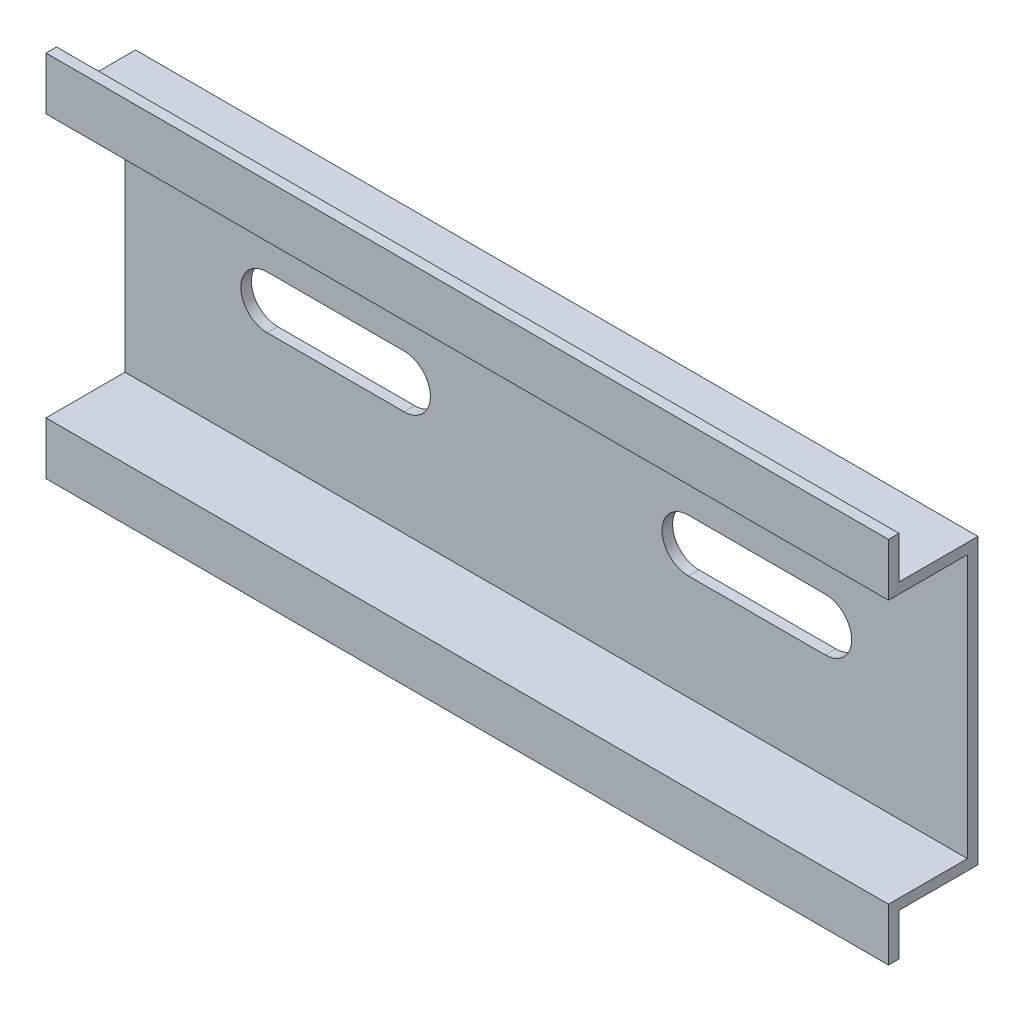
ISO-10303-21;
HEADER;
FILE_DESCRIPTION(('STEP AP214'),'2;1');
FILE_NAME('part.step','',(''),(''),'','','');
FILE_SCHEMA(('AUTOMOTIVE_DESIGN { 1 0 10303 214 1 1 1 1 }'));
ENDSEC;
DATA;
#1=APPLICATION_CONTEXT('core data for automotive mechanical design processes');
#2=APPLICATION_PROTOCOL_DEFINITION('international standard','automotive_design',2000,#1);
#3=PRODUCT_CONTEXT('',#1,'mechanical');
#4=PRODUCT('Part','Part','',(#3));
#5=PRODUCT_RELATED_PRODUCT_CATEGORY('part','',(#4));
#6=PRODUCT_DEFINITION_FORMATION('','',#4);
#7=PRODUCT_DEFINITION_CONTEXT('part definition',#1,'design');
#8=PRODUCT_DEFINITION('design','',#6,#7);
#9=PRODUCT_DEFINITION_SHAPE('','',#8);
#10=(LENGTH_UNIT() NAMED_UNIT(*) SI_UNIT(.MILLI.,.METRE.));
#11=(NAMED_UNIT(*) PLANE_ANGLE_UNIT() SI_UNIT($,.RADIAN.));
#12=(NAMED_UNIT(*) SI_UNIT($,.STERADIAN.) SOLID_ANGLE_UNIT());
#13=UNCERTAINTY_MEASURE_WITH_UNIT(LENGTH_MEASURE(1.E-05),#10,'distance_accuracy_value','');
#14=(GEOMETRIC_REPRESENTATION_CONTEXT(3) GLOBAL_UNCERTAINTY_ASSIGNED_CONTEXT((#13)) GLOBAL_UNIT_ASSIGNED_CONTEXT((#10,
#11,#12)) REPRESENTATION_CONTEXT('',''));
#15=CARTESIAN_POINT('',(0.,0.,0.));
#16=DIRECTION('',(0.,0.,1.));
#17=DIRECTION('',(1.,0.,0.));
#18=AXIS2_PLACEMENT_3D('',#15,#16,#17);
#19=CARTESIAN_POINT('',(80.,35.,0.));
#20=DIRECTION('',(0.,-1.,0.));
#21=DIRECTION('',(0.,0.,-1.));
#22=AXIS2_PLACEMENT_3D('',#19,#20,#21);
#23=PLANE('',#22);
#24=DIRECTION('',(0.,0.,1.));
#25=VECTOR('',#24,1.);
#26=CARTESIAN_POINT('',(0.,35.,0.));
#27=LINE('',#26,#25);
#28=CARTESIAN_POINT('',(0.,35.,-0.999999999999998));
#29=VERTEX_POINT('',#28);
#30=CARTESIAN_POINT('',(0.,35.,0.));
#31=VERTEX_POINT('',#30);
#32=EDGE_CURVE('E198',#29,#31,#27,.T.);
#33=ORIENTED_EDGE('',*,*,#32,.T.);
#34=DIRECTION('',(-1.,0.,0.));
#35=VECTOR('',#34,1.);
#36=CARTESIAN_POINT('',(80.,35.,0.));
#37=LINE('',#36,#35);
#38=CARTESIAN_POINT('',(80.,35.,0.));
#39=VERTEX_POINT('',#38);
#40=EDGE_CURVE('E11',#39,#31,#37,.T.);
#41=ORIENTED_EDGE('',*,*,#40,.F.);
#42=DIRECTION('',(0.,0.,1.));
#43=VECTOR('',#42,1.);
#44=CARTESIAN_POINT('',(80.,35.,0.));
#45=LINE('',#44,#43);
#46=CARTESIAN_POINT('',(80.,35.,-0.999999999999998));
#47=VERTEX_POINT('',#46);
#48=EDGE_CURVE('E272',#47,#39,#45,.T.);
#49=ORIENTED_EDGE('',*,*,#48,.F.);
#50=DIRECTION('',(-1.,0.,0.));
#51=VECTOR('',#50,1.);
#52=CARTESIAN_POINT('',(80.,35.,-0.999999999999998));
#53=LINE('',#52,#51);
#54=EDGE_CURVE('E310',#47,#29,#53,.T.);
#55=ORIENTED_EDGE('',*,*,#54,.T.);
#56=EDGE_LOOP('',(#33,#41,#49,#55));
#57=FACE_BOUND('',#56,.T.);
#58=ADVANCED_FACE('F43',(#57),#23,.F.);
#59=CARTESIAN_POINT('',(80.,35.,0.));
#60=DIRECTION('',(0.,0.,-1.));
#61=DIRECTION('',(0.,1.,0.));
#62=AXIS2_PLACEMENT_3D('',#59,#60,#61);
#63=PLANE('',#62);
#64=DIRECTION('',(0.,-1.,0.));
#65=VECTOR('',#64,1.);
#66=CARTESIAN_POINT('',(0.,35.,0.));
#67=LINE('',#66,#65);
#68=CARTESIAN_POINT('',(0.,30.,0.));
#69=VERTEX_POINT('',#68);
#70=EDGE_CURVE('E314',#31,#69,#67,.T.);
#71=ORIENTED_EDGE('',*,*,#70,.T.);
#72=DIRECTION('',(-1.,0.,0.));
#73=VECTOR('',#72,1.);
#74=CARTESIAN_POINT('',(80.,30.,0.));
#75=LINE('',#74,#73);
#76=CARTESIAN_POINT('',(80.,30.,0.));
#77=VERTEX_POINT('',#76);
#78=EDGE_CURVE('E51',#77,#69,#75,.T.);
#79=ORIENTED_EDGE('',*,*,#78,.F.);
#80=DIRECTION('',(0.,-1.,0.));
#81=VECTOR('',#80,1.);
#82=CARTESIAN_POINT('',(80.,35.,0.));
#83=LINE('',#82,#81);
#84=EDGE_CURVE('E276',#39,#77,#83,.T.);
#85=ORIENTED_EDGE('',*,*,#84,.F.);
#86=ORIENTED_EDGE('',*,*,#40,.T.);
#87=EDGE_LOOP('',(#71,#79,#85,#86));
#88=FACE_BOUND('',#87,.T.);
#89=ADVANCED_FACE('F413',(#88),#63,.F.);
#90=CARTESIAN_POINT('',(80.,30.,0.));
#91=DIRECTION('',(0.,1.,0.));
#92=DIRECTION('',(0.,0.,1.));
#93=AXIS2_PLACEMENT_3D('',#90,#91,#92);
#94=PLANE('',#93);
#95=DIRECTION('',(0.,0.,-1.));
#96=VECTOR('',#95,1.);
#97=CARTESIAN_POINT('',(0.,30.,0.));
#98=LINE('',#97,#96);
#99=CARTESIAN_POINT('',(0.,30.,-7.5));
#100=VERTEX_POINT('',#99);
#101=EDGE_CURVE('E317',#69,#100,#98,.T.);
#102=ORIENTED_EDGE('',*,*,#101,.T.);
#103=DIRECTION('',(-1.,0.,0.));
#104=VECTOR('',#103,1.);
#105=CARTESIAN_POINT('',(80.,30.,-7.5));
#106=LINE('',#105,#104);
#107=CARTESIAN_POINT('',(80.,30.,-7.5));
#108=VERTEX_POINT('',#107);
#109=EDGE_CURVE('E381',#108,#100,#106,.T.);
#110=ORIENTED_EDGE('',*,*,#109,.F.);
#111=DIRECTION('',(0.,0.,-1.));
#112=VECTOR('',#111,1.);
#113=CARTESIAN_POINT('',(80.,30.,0.));
#114=LINE('',#113,#112);
#115=EDGE_CURVE('E280',#77,#108,#114,.T.);
#116=ORIENTED_EDGE('',*,*,#115,.F.);
#117=ORIENTED_EDGE('',*,*,#78,.T.);
#118=EDGE_LOOP('',(#102,#110,#116,#117));
#119=FACE_BOUND('',#118,.T.);
#120=ADVANCED_FACE('F390',(#119),#94,.F.);
#121=CARTESIAN_POINT('',(80.,30.,-7.5));
#122=DIRECTION('',(0.,0.,-1.));
#123=DIRECTION('',(-1.,0.,0.));
#124=AXIS2_PLACEMENT_3D('',#121,#122,#123);
#125=PLANE('',#124);
#126=DIRECTION('',(1.,0.,0.));
#127=VECTOR('',#126,1.);
#128=CARTESIAN_POINT('',(13.5,15.,-7.5));
#129=LINE('',#128,#127);
#130=CARTESIAN_POINT('',(13.5,15.,-7.5));
#131=VERTEX_POINT('',#130);
#132=CARTESIAN_POINT('',(26.5,15.,-7.5));
#133=VERTEX_POINT('',#132);
#134=EDGE_CURVE('E209',#131,#133,#129,.T.);
#135=ORIENTED_EDGE('',*,*,#134,.F.);
#136=CARTESIAN_POINT('',(13.5,17.5,-7.5));
#137=DIRECTION('',(0.,0.,1.));
#138=DIRECTION('',(1.,0.,0.));
#139=AXIS2_PLACEMENT_3D('',#136,#137,#138);
#140=CIRCLE('',#139,2.5);
#141=CARTESIAN_POINT('',(13.5,20.,-7.5));
#142=VERTEX_POINT('',#141);
#143=EDGE_CURVE('E58',#142,#131,#140,.T.);
#144=ORIENTED_EDGE('',*,*,#143,.F.);
#145=DIRECTION('',(-1.,0.,0.));
#146=VECTOR('',#145,1.);
#147=CARTESIAN_POINT('',(13.5,20.,-7.5));
#148=LINE('',#147,#146);
#149=CARTESIAN_POINT('',(26.5,20.,-7.5));
#150=VERTEX_POINT('',#149);
#151=EDGE_CURVE('E189',#150,#142,#148,.T.);
#152=ORIENTED_EDGE('',*,*,#151,.F.);
#153=CARTESIAN_POINT('',(26.5,17.5,-7.5));
#154=DIRECTION('',(0.,0.,1.));
#155=DIRECTION('',(1.,0.,0.));
#156=AXIS2_PLACEMENT_3D('',#153,#154,#155);
#157=CIRCLE('',#156,2.5);
#158=EDGE_CURVE('E217',#133,#150,#157,.T.);
#159=ORIENTED_EDGE('',*,*,#158,.F.);
#160=EDGE_LOOP('',(#135,#144,#152,#159));
#161=FACE_BOUND('',#160,.T.);
#162=DIRECTION('',(1.,0.,0.));
#163=VECTOR('',#162,1.);
#164=CARTESIAN_POINT('',(53.5,15.,-7.5));
#165=LINE('',#164,#163);
#166=CARTESIAN_POINT('',(53.5,15.,-7.5));
#167=VERTEX_POINT('',#166);
#168=CARTESIAN_POINT('',(66.5,15.,-7.5));
#169=VERTEX_POINT('',#168);
#170=EDGE_CURVE('E255',#167,#169,#165,.T.);
#171=ORIENTED_EDGE('',*,*,#170,.F.);
#172=CARTESIAN_POINT('',(53.5,17.5,-7.5));
#173=DIRECTION('',(0.,0.,1.));
#174=DIRECTION('',(1.,0.,0.));
#175=AXIS2_PLACEMENT_3D('',#172,#173,#174);
#176=CIRCLE('',#175,2.5);
#177=CARTESIAN_POINT('',(53.5,20.,-7.5));
#178=VERTEX_POINT('',#177);
#179=EDGE_CURVE('E66',#178,#167,#176,.T.);
#180=ORIENTED_EDGE('',*,*,#179,.F.);
#181=DIRECTION('',(-1.,0.,0.));
#182=VECTOR('',#181,1.);
#183=CARTESIAN_POINT('',(53.5,20.,-7.5));
#184=LINE('',#183,#182);
#185=CARTESIAN_POINT('',(66.5,20.,-7.5));
#186=VERTEX_POINT('',#185);
#187=EDGE_CURVE('E239',#186,#178,#184,.T.);
#188=ORIENTED_EDGE('',*,*,#187,.F.);
#189=CARTESIAN_POINT('',(66.5,17.5,-7.5));
#190=DIRECTION('',(0.,0.,1.));
#191=DIRECTION('',(1.,0.,0.));
#192=AXIS2_PLACEMENT_3D('',#189,#190,#191);
#193=CIRCLE('',#192,2.5);
#194=EDGE_CURVE('E251',#169,#186,#193,.T.);
#195=ORIENTED_EDGE('',*,*,#194,.F.);
#196=EDGE_LOOP('',(#171,#180,#188,#195));
#197=FACE_BOUND('',#196,.T.);
#198=DIRECTION('',(0.,-1.,0.));
#199=VECTOR('',#198,1.);
#200=CARTESIAN_POINT('',(0.,30.,-7.5));
#201=LINE('',#200,#199);
#202=CARTESIAN_POINT('',(0.,5.,-7.5));
#203=VERTEX_POINT('',#202);
#204=EDGE_CURVE('E320',#100,#203,#201,.T.);
#205=ORIENTED_EDGE('',*,*,#204,.T.);
#206=DIRECTION('',(-1.,0.,0.));
#207=VECTOR('',#206,1.);
#208=CARTESIAN_POINT('',(80.,5.,-7.5));
#209=LINE('',#208,#207);
#210=CARTESIAN_POINT('',(80.,5.,-7.5));
#211=VERTEX_POINT('',#210);
#212=EDGE_CURVE('E377',#211,#203,#209,.T.);
#213=ORIENTED_EDGE('',*,*,#212,.F.);
#214=DIRECTION('',(0.,-1.,0.));
#215=VECTOR('',#214,1.);
#216=CARTESIAN_POINT('',(80.,30.,-7.5));
#217=LINE('',#216,#215);
#218=EDGE_CURVE('E283',#108,#211,#217,.T.);
#219=ORIENTED_EDGE('',*,*,#218,.F.);
#220=ORIENTED_EDGE('',*,*,#109,.T.);
#221=EDGE_LOOP('',(#205,#213,#219,#220));
#222=FACE_BOUND('',#221,.T.);
#223=ADVANCED_FACE('F401',(#161,#197,#222),#125,.F.);
#224=CARTESIAN_POINT('',(80.,5.,-7.5));
#225=DIRECTION('',(0.,-1.,0.));
#226=DIRECTION('',(0.,0.,-1.));
#227=AXIS2_PLACEMENT_3D('',#224,#225,#226);
#228=PLANE('',#227);
#229=DIRECTION('',(0.,0.,1.));
#230=VECTOR('',#229,1.);
#231=CARTESIAN_POINT('',(0.,5.,-7.5));
#232=LINE('',#231,#230);
#233=CARTESIAN_POINT('',(0.,5.,0.));
#234=VERTEX_POINT('',#233);
#235=EDGE_CURVE('E323',#203,#234,#232,.T.);
#236=ORIENTED_EDGE('',*,*,#235,.T.);
#237=DIRECTION('',(-1.,0.,0.));
#238=VECTOR('',#237,1.);
#239=CARTESIAN_POINT('',(80.,5.,0.));
#240=LINE('',#239,#238);
#241=CARTESIAN_POINT('',(80.,5.,0.));
#242=VERTEX_POINT('',#241);
#243=EDGE_CURVE('E373',#242,#234,#240,.T.);
#244=ORIENTED_EDGE('',*,*,#243,.F.);
#245=DIRECTION('',(0.,0.,1.));
#246=VECTOR('',#245,1.);
#247=CARTESIAN_POINT('',(80.,5.,-7.5));
#248=LINE('',#247,#246);
#249=EDGE_CURVE('E286',#211,#242,#248,.T.);
#250=ORIENTED_EDGE('',*,*,#249,.F.);
#251=ORIENTED_EDGE('',*,*,#212,.T.);
#252=EDGE_LOOP('',(#236,#244,#250,#251));
#253=FACE_BOUND('',#252,.T.);
#254=ADVANCED_FACE('F405',(#253),#228,.F.);
#255=CARTESIAN_POINT('',(80.,5.,0.));
#256=DIRECTION('',(0.,0.,-1.));
#257=DIRECTION('',(-1.,0.,0.));
#258=AXIS2_PLACEMENT_3D('',#255,#256,#257);
#259=PLANE('',#258);
#260=DIRECTION('',(0.,-1.,0.));
#261=VECTOR('',#260,1.);
#262=CARTESIAN_POINT('',(0.,5.,0.));
#263=LINE('',#262,#261);
#264=CARTESIAN_POINT('',(0.,0.,0.));
#265=VERTEX_POINT('',#264);
#266=EDGE_CURVE('E326',#234,#265,#263,.T.);
#267=ORIENTED_EDGE('',*,*,#266,.T.);
#268=DIRECTION('',(-1.,0.,0.));
#269=VECTOR('',#268,1.);
#270=CARTESIAN_POINT('',(80.,0.,0.));
#271=LINE('',#270,#269);
#272=CARTESIAN_POINT('',(80.,0.,0.));
#273=VERTEX_POINT('',#272);
#274=EDGE_CURVE('E369',#273,#265,#271,.T.);
#275=ORIENTED_EDGE('',*,*,#274,.F.);
#276=DIRECTION('',(0.,-1.,0.));
#277=VECTOR('',#276,1.);
#278=CARTESIAN_POINT('',(80.,5.,0.));
#279=LINE('',#278,#277);
#280=EDGE_CURVE('E289',#242,#273,#279,.T.);
#281=ORIENTED_EDGE('',*,*,#280,.F.);
#282=ORIENTED_EDGE('',*,*,#243,.T.);
#283=EDGE_LOOP('',(#267,#275,#281,#282));
#284=FACE_BOUND('',#283,.T.);
#285=ADVANCED_FACE('F445',(#284),#259,.F.);
#286=CARTESIAN_POINT('',(80.,0.,0.));
#287=DIRECTION('',(0.,1.,0.));
#288=DIRECTION('',(0.,0.,1.));
#289=AXIS2_PLACEMENT_3D('',#286,#287,#288);
#290=PLANE('',#289);
#291=DIRECTION('',(0.,0.,-1.));
#292=VECTOR('',#291,1.);
#293=CARTESIAN_POINT('',(0.,0.,0.));
#294=LINE('',#293,#292);
#295=CARTESIAN_POINT('',(0.,0.,-1.));
#296=VERTEX_POINT('',#295);
#297=EDGE_CURVE('E329',#265,#296,#294,.T.);
#298=ORIENTED_EDGE('',*,*,#297,.T.);
#299=DIRECTION('',(-1.,0.,0.));
#300=VECTOR('',#299,1.);
#301=CARTESIAN_POINT('',(80.,0.,-1.));
#302=LINE('',#301,#300);
#303=CARTESIAN_POINT('',(80.,0.,-1.));
#304=VERTEX_POINT('',#303);
#305=EDGE_CURVE('E365',#304,#296,#302,.T.);
#306=ORIENTED_EDGE('',*,*,#305,.F.);
#307=DIRECTION('',(0.,0.,-1.));
#308=VECTOR('',#307,1.);
#309=CARTESIAN_POINT('',(80.,0.,0.));
#310=LINE('',#309,#308);
#311=EDGE_CURVE('E292',#273,#304,#310,.T.);
#312=ORIENTED_EDGE('',*,*,#311,.F.);
#313=ORIENTED_EDGE('',*,*,#274,.T.);
#314=EDGE_LOOP('',(#298,#306,#312,#313));
#315=FACE_BOUND('',#314,.T.);
#316=ADVANCED_FACE('F443',(#315),#290,.F.);
#317=CARTESIAN_POINT('',(80.,4.,-1.));
#318=DIRECTION('',(0.,0.,1.));
#319=DIRECTION('',(0.,-1.,0.));
#320=AXIS2_PLACEMENT_3D('',#317,#318,#319);
#321=PLANE('',#320);
#322=DIRECTION('',(0.,1.,0.));
#323=VECTOR('',#322,1.);
#324=CARTESIAN_POINT('',(0.,4.,-1.));
#325=LINE('',#324,#323);
#326=CARTESIAN_POINT('',(0.,4.,-1.));
#327=VERTEX_POINT('',#326);
#328=EDGE_CURVE('E332',#296,#327,#325,.T.);
#329=ORIENTED_EDGE('',*,*,#328,.T.);
#330=DIRECTION('',(-1.,0.,0.));
#331=VECTOR('',#330,1.);
#332=CARTESIAN_POINT('',(80.,4.,-1.));
#333=LINE('',#332,#331);
#334=CARTESIAN_POINT('',(80.,4.,-1.));
#335=VERTEX_POINT('',#334);
#336=EDGE_CURVE('E361',#335,#327,#333,.T.);
#337=ORIENTED_EDGE('',*,*,#336,.F.);
#338=DIRECTION('',(0.,1.,0.));
#339=VECTOR('',#338,1.);
#340=CARTESIAN_POINT('',(80.,4.,-1.));
#341=LINE('',#340,#339);
#342=EDGE_CURVE('E295',#304,#335,#341,.T.);
#343=ORIENTED_EDGE('',*,*,#342,.F.);
#344=ORIENTED_EDGE('',*,*,#305,.T.);
#345=EDGE_LOOP('',(#329,#337,#343,#344));
#346=FACE_BOUND('',#345,.T.);
#347=ADVANCED_FACE('F439',(#346),#321,.F.);
#348=CARTESIAN_POINT('',(80.,4.,-8.5));
#349=DIRECTION('',(0.,1.,0.));
#350=DIRECTION('',(0.,0.,1.));
#351=AXIS2_PLACEMENT_3D('',#348,#349,#350);
#352=PLANE('',#351);
#353=DIRECTION('',(0.,0.,-1.));
#354=VECTOR('',#353,1.);
#355=CARTESIAN_POINT('',(0.,4.,-8.5));
#356=LINE('',#355,#354);
#357=CARTESIAN_POINT('',(0.,4.,-8.5));
#358=VERTEX_POINT('',#357);
#359=EDGE_CURVE('E335',#327,#358,#356,.T.);
#360=ORIENTED_EDGE('',*,*,#359,.T.);
#361=DIRECTION('',(-1.,0.,0.));
#362=VECTOR('',#361,1.);
#363=CARTESIAN_POINT('',(80.,4.,-8.5));
#364=LINE('',#363,#362);
#365=CARTESIAN_POINT('',(80.,4.,-8.5));
#366=VERTEX_POINT('',#365);
#367=EDGE_CURVE('E357',#366,#358,#364,.T.);
#368=ORIENTED_EDGE('',*,*,#367,.F.);
#369=DIRECTION('',(0.,0.,-1.));
#370=VECTOR('',#369,1.);
#371=CARTESIAN_POINT('',(80.,4.,-8.5));
#372=LINE('',#371,#370);
#373=EDGE_CURVE('E298',#335,#366,#372,.T.);
#374=ORIENTED_EDGE('',*,*,#373,.F.);
#375=ORIENTED_EDGE('',*,*,#336,.T.);
#376=EDGE_LOOP('',(#360,#368,#374,#375));
#377=FACE_BOUND('',#376,.T.);
#378=ADVANCED_FACE('F434',(#377),#352,.F.);
#379=CARTESIAN_POINT('',(80.,31.,-8.5));
#380=DIRECTION('',(0.,0.,1.));
#381=DIRECTION('',(0.,-1.,0.));
#382=AXIS2_PLACEMENT_3D('',#379,#380,#381);
#383=PLANE('',#382);
#384=DIRECTION('',(1.,0.,0.));
#385=VECTOR('',#384,1.);
#386=CARTESIAN_POINT('',(13.5,20.,-8.5));
#387=LINE('',#386,#385);
#388=CARTESIAN_POINT('',(13.5,20.,-8.5));
#389=VERTEX_POINT('',#388);
#390=CARTESIAN_POINT('',(26.5,20.,-8.5));
#391=VERTEX_POINT('',#390);
#392=EDGE_CURVE('E204',#389,#391,#387,.T.);
#393=ORIENTED_EDGE('',*,*,#392,.F.);
#394=CARTESIAN_POINT('',(13.5,17.5,-8.5));
#395=DIRECTION('',(0.,0.,1.));
#396=DIRECTION('',(0.,-1.,0.));
#397=AXIS2_PLACEMENT_3D('',#394,#395,#396);
#398=CIRCLE('',#397,2.5);
#399=CARTESIAN_POINT('',(13.5,15.,-8.5));
#400=VERTEX_POINT('',#399);
#401=EDGE_CURVE('E182',#400,#389,#398,.F.);
#402=ORIENTED_EDGE('',*,*,#401,.F.);
#403=DIRECTION('',(-1.,0.,0.));
#404=VECTOR('',#403,1.);
#405=CARTESIAN_POINT('',(13.5,15.,-8.5));
#406=LINE('',#405,#404);
#407=CARTESIAN_POINT('',(26.5,15.,-8.5));
#408=VERTEX_POINT('',#407);
#409=EDGE_CURVE('E193',#408,#400,#406,.T.);
#410=ORIENTED_EDGE('',*,*,#409,.F.);
#411=CARTESIAN_POINT('',(26.5,17.5,-8.5));
#412=DIRECTION('',(0.,0.,1.));
#413=DIRECTION('',(0.,-1.,0.));
#414=AXIS2_PLACEMENT_3D('',#411,#412,#413);
#415=CIRCLE('',#414,2.5);
#416=EDGE_CURVE('E211',#391,#408,#415,.F.);
#417=ORIENTED_EDGE('',*,*,#416,.F.);
#418=EDGE_LOOP('',(#393,#402,#410,#417));
#419=FACE_BOUND('',#418,.T.);
#420=DIRECTION('',(1.,0.,0.));
#421=VECTOR('',#420,1.);
#422=CARTESIAN_POINT('',(53.5,20.,-8.5));
#423=LINE('',#422,#421);
#424=CARTESIAN_POINT('',(53.5,20.,-8.5));
#425=VERTEX_POINT('',#424);
#426=CARTESIAN_POINT('',(66.5,20.,-8.5));
#427=VERTEX_POINT('',#426);
#428=EDGE_CURVE('E265',#425,#427,#423,.T.);
#429=ORIENTED_EDGE('',*,*,#428,.F.);
#430=CARTESIAN_POINT('',(53.5,17.5,-8.5));
#431=DIRECTION('',(0.,0.,1.));
#432=DIRECTION('',(0.,-1.,0.));
#433=AXIS2_PLACEMENT_3D('',#430,#431,#432);
#434=CIRCLE('',#433,2.5);
#435=CARTESIAN_POINT('',(53.5,15.,-8.5));
#436=VERTEX_POINT('',#435);
#437=EDGE_CURVE('E261',#436,#425,#434,.F.);
#438=ORIENTED_EDGE('',*,*,#437,.F.);
#439=DIRECTION('',(-1.,0.,0.));
#440=VECTOR('',#439,1.);
#441=CARTESIAN_POINT('',(53.5,15.,-8.5));
#442=LINE('',#441,#440);
#443=CARTESIAN_POINT('',(66.5,15.,-8.5));
#444=VERTEX_POINT('',#443);
#445=EDGE_CURVE('E231',#444,#436,#442,.T.);
#446=ORIENTED_EDGE('',*,*,#445,.F.);
#447=CARTESIAN_POINT('',(66.5,17.5,-8.5));
#448=DIRECTION('',(0.,0.,1.));
#449=DIRECTION('',(0.,-1.,0.));
#450=AXIS2_PLACEMENT_3D('',#447,#448,#449);
#451=CIRCLE('',#450,2.5);
#452=EDGE_CURVE('E269',#427,#444,#451,.F.);
#453=ORIENTED_EDGE('',*,*,#452,.F.);
#454=EDGE_LOOP('',(#429,#438,#446,#453));
#455=FACE_BOUND('',#454,.T.);
#456=DIRECTION('',(0.,1.,0.));
#457=VECTOR('',#456,1.);
#458=CARTESIAN_POINT('',(0.,31.,-8.5));
#459=LINE('',#458,#457);
#460=CARTESIAN_POINT('',(0.,31.,-8.5));
#461=VERTEX_POINT('',#460);
#462=EDGE_CURVE('E338',#358,#461,#459,.T.);
#463=ORIENTED_EDGE('',*,*,#462,.T.);
#464=DIRECTION('',(-1.,0.,0.));
#465=VECTOR('',#464,1.);
#466=CARTESIAN_POINT('',(80.,31.,-8.5));
#467=LINE('',#466,#465);
#468=CARTESIAN_POINT('',(80.,31.,-8.5));
#469=VERTEX_POINT('',#468);
#470=EDGE_CURVE('E353',#469,#461,#467,.T.);
#471=ORIENTED_EDGE('',*,*,#470,.F.);
#472=DIRECTION('',(0.,1.,0.));
#473=VECTOR('',#472,1.);
#474=CARTESIAN_POINT('',(80.,31.,-8.5));
#475=LINE('',#474,#473);
#476=EDGE_CURVE('E301',#366,#469,#475,.T.);
#477=ORIENTED_EDGE('',*,*,#476,.F.);
#478=ORIENTED_EDGE('',*,*,#367,.T.);
#479=EDGE_LOOP('',(#463,#471,#477,#478));
#480=FACE_BOUND('',#479,.T.);
#481=ADVANCED_FACE('F201',(#419,#455,#480),#383,.F.);
#482=CARTESIAN_POINT('',(80.,31.,-0.999999999999999));
#483=DIRECTION('',(0.,-1.,0.));
#484=DIRECTION('',(0.,0.,-1.));
#485=AXIS2_PLACEMENT_3D('',#482,#483,#484);
#486=PLANE('',#485);
#487=DIRECTION('',(0.,0.,1.));
#488=VECTOR('',#487,1.);
#489=CARTESIAN_POINT('',(0.,31.,-0.999999999999999));
#490=LINE('',#489,#488);
#491=CARTESIAN_POINT('',(0.,31.,-0.999999999999999));
#492=VERTEX_POINT('',#491);
#493=EDGE_CURVE('E341',#461,#492,#490,.T.);
#494=ORIENTED_EDGE('',*,*,#493,.T.);
#495=DIRECTION('',(-1.,0.,0.));
#496=VECTOR('',#495,1.);
#497=CARTESIAN_POINT('',(80.,31.,-0.999999999999999));
#498=LINE('',#497,#496);
#499=CARTESIAN_POINT('',(80.,31.,-0.999999999999999));
#500=VERTEX_POINT('',#499);
#501=EDGE_CURVE('E349',#500,#492,#498,.T.);
#502=ORIENTED_EDGE('',*,*,#501,.F.);
#503=DIRECTION('',(0.,0.,1.));
#504=VECTOR('',#503,1.);
#505=CARTESIAN_POINT('',(80.,31.,-0.999999999999999));
#506=LINE('',#505,#504);
#507=EDGE_CURVE('E304',#469,#500,#506,.T.);
#508=ORIENTED_EDGE('',*,*,#507,.F.);
#509=ORIENTED_EDGE('',*,*,#470,.T.);
#510=EDGE_LOOP('',(#494,#502,#508,#509));
#511=FACE_BOUND('',#510,.T.);
#512=ADVANCED_FACE('F425',(#511),#486,.F.);
#513=CARTESIAN_POINT('',(80.,35.,-0.999999999999998));
#514=DIRECTION('',(0.,0.,1.));
#515=DIRECTION('',(0.,-1.,0.));
#516=AXIS2_PLACEMENT_3D('',#513,#514,#515);
#517=PLANE('',#516);
#518=DIRECTION('',(0.,1.,0.));
#519=VECTOR('',#518,1.);
#520=CARTESIAN_POINT('',(0.,35.,-0.999999999999998));
#521=LINE('',#520,#519);
#522=EDGE_CURVE('E277',#492,#29,#521,.T.);
#523=ORIENTED_EDGE('',*,*,#522,.T.);
#524=ORIENTED_EDGE('',*,*,#54,.F.);
#525=DIRECTION('',(0.,1.,0.));
#526=VECTOR('',#525,1.);
#527=CARTESIAN_POINT('',(80.,35.,-0.999999999999998));
#528=LINE('',#527,#526);
#529=EDGE_CURVE('E307',#500,#47,#528,.T.);
#530=ORIENTED_EDGE('',*,*,#529,.F.);
#531=ORIENTED_EDGE('',*,*,#501,.T.);
#532=EDGE_LOOP('',(#523,#524,#530,#531));
#533=FACE_BOUND('',#532,.T.);
#534=ADVANCED_FACE('F420',(#533),#517,.F.);
#535=CARTESIAN_POINT('',(80.,0.,0.));
#536=DIRECTION('',(-1.,0.,0.));
#537=DIRECTION('',(0.,0.,1.));
#538=AXIS2_PLACEMENT_3D('',#535,#536,#537);
#539=PLANE('',#538);
#540=ORIENTED_EDGE('',*,*,#48,.T.);
#541=ORIENTED_EDGE('',*,*,#84,.T.);
#542=ORIENTED_EDGE('',*,*,#115,.T.);
#543=ORIENTED_EDGE('',*,*,#218,.T.);
#544=ORIENTED_EDGE('',*,*,#249,.T.);
#545=ORIENTED_EDGE('',*,*,#280,.T.);
#546=ORIENTED_EDGE('',*,*,#311,.T.);
#547=ORIENTED_EDGE('',*,*,#342,.T.);
#548=ORIENTED_EDGE('',*,*,#373,.T.);
#549=ORIENTED_EDGE('',*,*,#476,.T.);
#550=ORIENTED_EDGE('',*,*,#507,.T.);
#551=ORIENTED_EDGE('',*,*,#529,.T.);
#552=EDGE_LOOP('',(#540,#541,#542,#543,#544,#545,#546,#547,#548,#549,#550,#551));
#553=FACE_BOUND('',#552,.T.);
#554=ADVANCED_FACE('F409',(#553),#539,.F.);
#555=CARTESIAN_POINT('',(0.,0.,0.));
#556=DIRECTION('',(-1.,0.,0.));
#557=DIRECTION('',(0.,0.,1.));
#558=AXIS2_PLACEMENT_3D('',#555,#556,#557);
#559=PLANE('',#558);
#560=ORIENTED_EDGE('',*,*,#32,.F.);
#561=ORIENTED_EDGE('',*,*,#522,.F.);
#562=ORIENTED_EDGE('',*,*,#493,.F.);
#563=ORIENTED_EDGE('',*,*,#462,.F.);
#564=ORIENTED_EDGE('',*,*,#359,.F.);
#565=ORIENTED_EDGE('',*,*,#328,.F.);
#566=ORIENTED_EDGE('',*,*,#297,.F.);
#567=ORIENTED_EDGE('',*,*,#266,.F.);
#568=ORIENTED_EDGE('',*,*,#235,.F.);
#569=ORIENTED_EDGE('',*,*,#204,.F.);
#570=ORIENTED_EDGE('',*,*,#101,.F.);
#571=ORIENTED_EDGE('',*,*,#70,.F.);
#572=EDGE_LOOP('',(#560,#561,#562,#563,#564,#565,#566,#567,#568,#569,#570,#571));
#573=FACE_BOUND('',#572,.T.);
#574=ADVANCED_FACE('F396',(#573),#559,.T.);
#575=CARTESIAN_POINT('',(53.5,17.5,-8.501));
#576=DIRECTION('',(0.,0.,1.));
#577=DIRECTION('',(1.,0.,0.));
#578=AXIS2_PLACEMENT_3D('',#575,#576,#577);
#579=CYLINDRICAL_SURFACE('',#578,2.5);
#580=ORIENTED_EDGE('',*,*,#437,.T.);
#581=DIRECTION('',(0.,0.,1.));
#582=VECTOR('',#581,1.);
#583=CARTESIAN_POINT('',(53.5,20.,-8.501));
#584=LINE('',#583,#582);
#585=EDGE_CURVE('E235',#425,#178,#584,.T.);
#586=ORIENTED_EDGE('',*,*,#585,.T.);
#587=ORIENTED_EDGE('',*,*,#179,.T.);
#588=DIRECTION('',(0.,0.,1.));
#589=VECTOR('',#588,1.);
#590=CARTESIAN_POINT('',(53.5,15.,-8.501));
#591=LINE('',#590,#589);
#592=EDGE_CURVE('E236',#436,#167,#591,.T.);
#593=ORIENTED_EDGE('',*,*,#592,.F.);
#594=EDGE_LOOP('',(#580,#586,#587,#593));
#595=FACE_BOUND('',#594,.T.);
#596=ADVANCED_FACE('F477',(#595),#579,.F.);
#597=CARTESIAN_POINT('',(53.5,20.,-8.501));
#598=DIRECTION('',(0.,1.,0.));
#599=DIRECTION('',(0.,0.,1.));
#600=AXIS2_PLACEMENT_3D('',#597,#598,#599);
#601=PLANE('',#600);
#602=ORIENTED_EDGE('',*,*,#428,.T.);
#603=DIRECTION('',(0.,0.,1.));
#604=VECTOR('',#603,1.);
#605=CARTESIAN_POINT('',(66.5,20.,-8.501));
#606=LINE('',#605,#604);
#607=EDGE_CURVE('E243',#427,#186,#606,.T.);
#608=ORIENTED_EDGE('',*,*,#607,.T.);
#609=ORIENTED_EDGE('',*,*,#187,.T.);
#610=ORIENTED_EDGE('',*,*,#585,.F.);
#611=EDGE_LOOP('',(#602,#608,#609,#610));
#612=FACE_BOUND('',#611,.T.);
#613=ADVANCED_FACE('F481',(#612),#601,.F.);
#614=CARTESIAN_POINT('',(66.5,17.5,-8.501));
#615=DIRECTION('',(0.,0.,1.));
#616=DIRECTION('',(1.,0.,0.));
#617=AXIS2_PLACEMENT_3D('',#614,#615,#616);
#618=CYLINDRICAL_SURFACE('',#617,2.5);
#619=ORIENTED_EDGE('',*,*,#452,.T.);
#620=DIRECTION('',(0.,0.,1.));
#621=VECTOR('',#620,1.);
#622=CARTESIAN_POINT('',(66.5,15.,-8.501));
#623=LINE('',#622,#621);
#624=EDGE_CURVE('E240',#444,#169,#623,.T.);
#625=ORIENTED_EDGE('',*,*,#624,.T.);
#626=ORIENTED_EDGE('',*,*,#194,.T.);
#627=ORIENTED_EDGE('',*,*,#607,.F.);
#628=EDGE_LOOP('',(#619,#625,#626,#627));
#629=FACE_BOUND('',#628,.T.);
#630=ADVANCED_FACE('F483',(#629),#618,.F.);
#631=CARTESIAN_POINT('',(53.5,15.,-8.501));
#632=DIRECTION('',(0.,-1.,0.));
#633=DIRECTION('',(0.,0.,-1.));
#634=AXIS2_PLACEMENT_3D('',#631,#632,#633);
#635=PLANE('',#634);
#636=ORIENTED_EDGE('',*,*,#445,.T.);
#637=ORIENTED_EDGE('',*,*,#592,.T.);
#638=ORIENTED_EDGE('',*,*,#170,.T.);
#639=ORIENTED_EDGE('',*,*,#624,.F.);
#640=EDGE_LOOP('',(#636,#637,#638,#639));
#641=FACE_BOUND('',#640,.T.);
#642=ADVANCED_FACE('F474',(#641),#635,.F.);
#643=CARTESIAN_POINT('',(13.5,17.5,-8.501));
#644=DIRECTION('',(0.,0.,1.));
#645=DIRECTION('',(1.,0.,0.));
#646=AXIS2_PLACEMENT_3D('',#643,#644,#645);
#647=CYLINDRICAL_SURFACE('',#646,2.5);
#648=ORIENTED_EDGE('',*,*,#401,.T.);
#649=DIRECTION('',(0.,0.,1.));
#650=VECTOR('',#649,1.);
#651=CARTESIAN_POINT('',(13.5,20.,-8.501));
#652=LINE('',#651,#650);
#653=EDGE_CURVE('E199',#389,#142,#652,.T.);
#654=ORIENTED_EDGE('',*,*,#653,.T.);
#655=ORIENTED_EDGE('',*,*,#143,.T.);
#656=DIRECTION('',(0.,0.,1.));
#657=VECTOR('',#656,1.);
#658=CARTESIAN_POINT('',(13.5,15.,-8.501));
#659=LINE('',#658,#657);
#660=EDGE_CURVE('E178',#400,#131,#659,.T.);
#661=ORIENTED_EDGE('',*,*,#660,.F.);
#662=EDGE_LOOP('',(#648,#654,#655,#661));
#663=FACE_BOUND('',#662,.T.);
#664=ADVANCED_FACE('F180',(#663),#647,.F.);
#665=CARTESIAN_POINT('',(13.5,20.,-8.501));
#666=DIRECTION('',(0.,1.,0.));
#667=DIRECTION('',(-1.,0.,0.));
#668=AXIS2_PLACEMENT_3D('',#665,#666,#667);
#669=PLANE('',#668);
#670=ORIENTED_EDGE('',*,*,#392,.T.);
#671=DIRECTION('',(0.,0.,1.));
#672=VECTOR('',#671,1.);
#673=CARTESIAN_POINT('',(26.5,20.,-8.501));
#674=LINE('',#673,#672);
#675=EDGE_CURVE('E226',#391,#150,#674,.T.);
#676=ORIENTED_EDGE('',*,*,#675,.T.);
#677=ORIENTED_EDGE('',*,*,#151,.T.);
#678=ORIENTED_EDGE('',*,*,#653,.F.);
#679=EDGE_LOOP('',(#670,#676,#677,#678));
#680=FACE_BOUND('',#679,.T.);
#681=ADVANCED_FACE('F566',(#680),#669,.F.);
#682=CARTESIAN_POINT('',(26.5,17.5,-8.501));
#683=DIRECTION('',(0.,0.,1.));
#684=DIRECTION('',(1.,0.,0.));
#685=AXIS2_PLACEMENT_3D('',#682,#683,#684);
#686=CYLINDRICAL_SURFACE('',#685,2.5);
#687=ORIENTED_EDGE('',*,*,#416,.T.);
#688=DIRECTION('',(0.,0.,1.));
#689=VECTOR('',#688,1.);
#690=CARTESIAN_POINT('',(26.5,15.,-8.501));
#691=LINE('',#690,#689);
#692=EDGE_CURVE('E188',#408,#133,#691,.T.);
#693=ORIENTED_EDGE('',*,*,#692,.T.);
#694=ORIENTED_EDGE('',*,*,#158,.T.);
#695=ORIENTED_EDGE('',*,*,#675,.F.);
#696=EDGE_LOOP('',(#687,#693,#694,#695));
#697=FACE_BOUND('',#696,.T.);
#698=ADVANCED_FACE('F576',(#697),#686,.F.);
#699=CARTESIAN_POINT('',(13.5,15.,-8.501));
#700=DIRECTION('',(0.,-1.,0.));
#701=DIRECTION('',(1.,0.,0.));
#702=AXIS2_PLACEMENT_3D('',#699,#700,#701);
#703=PLANE('',#702);
#704=ORIENTED_EDGE('',*,*,#409,.T.);
#705=ORIENTED_EDGE('',*,*,#660,.T.);
#706=ORIENTED_EDGE('',*,*,#134,.T.);
#707=ORIENTED_EDGE('',*,*,#692,.F.);
#708=EDGE_LOOP('',(#704,#705,#706,#707));
#709=FACE_BOUND('',#708,.T.);
#710=ADVANCED_FACE('F194',(#709),#703,.F.);
#711=CLOSED_SHELL('',(#58,#89,#120,#223,#254,#285,#316,#347,#378,#481,#512,#534,#554,#574,#596,
#613,#630,#642,#664,#681,#698,#710));
#712=MANIFOLD_SOLID_BREP('B2',#711);
#713=ADVANCED_BREP_SHAPE_REPRESENTATION('',(#18,#712),#14);
#714=SHAPE_DEFINITION_REPRESENTATION(#9,#713);
ENDSEC;
END-ISO-10303-21;
